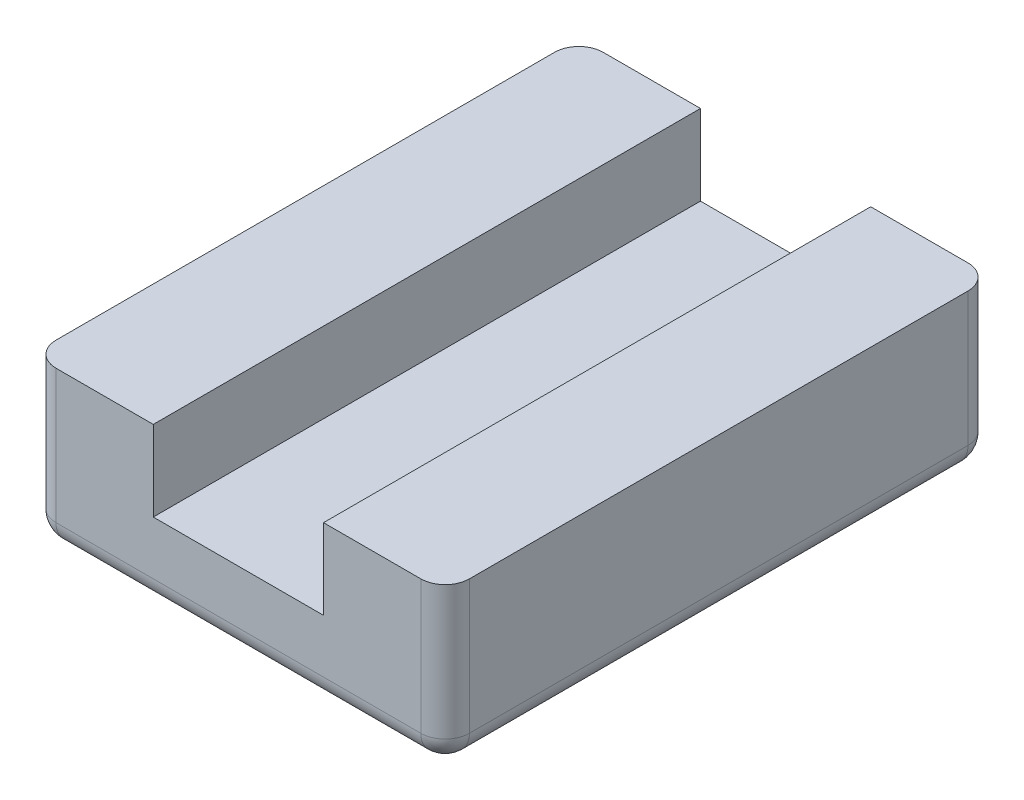
ISO-10303-21;
HEADER;
FILE_DESCRIPTION(('STEP AP214'),'2;1');
FILE_NAME('part.step','',(''),(''),'','','');
FILE_SCHEMA(('AUTOMOTIVE_DESIGN { 1 0 10303 214 1 1 1 1 }'));
ENDSEC;
DATA;
#1=APPLICATION_CONTEXT('core data for automotive mechanical design processes');
#2=APPLICATION_PROTOCOL_DEFINITION('international standard','automotive_design',2000,#1);
#3=PRODUCT_CONTEXT('',#1,'mechanical');
#4=PRODUCT('Part','Part','',(#3));
#5=PRODUCT_RELATED_PRODUCT_CATEGORY('part','',(#4));
#6=PRODUCT_DEFINITION_FORMATION('','',#4);
#7=PRODUCT_DEFINITION_CONTEXT('part definition',#1,'design');
#8=PRODUCT_DEFINITION('design','',#6,#7);
#9=PRODUCT_DEFINITION_SHAPE('','',#8);
#10=(LENGTH_UNIT() NAMED_UNIT(*) SI_UNIT(.MILLI.,.METRE.));
#11=(NAMED_UNIT(*) PLANE_ANGLE_UNIT() SI_UNIT($,.RADIAN.));
#12=(NAMED_UNIT(*) SI_UNIT($,.STERADIAN.) SOLID_ANGLE_UNIT());
#13=UNCERTAINTY_MEASURE_WITH_UNIT(LENGTH_MEASURE(1.E-05),#10,'distance_accuracy_value','');
#14=(GEOMETRIC_REPRESENTATION_CONTEXT(3) GLOBAL_UNCERTAINTY_ASSIGNED_CONTEXT((#13)) GLOBAL_UNIT_ASSIGNED_CONTEXT((#10,
#11,#12)) REPRESENTATION_CONTEXT('',''));
#15=CARTESIAN_POINT('',(0.,0.,0.));
#16=DIRECTION('',(0.,0.,1.));
#17=DIRECTION('',(1.,0.,0.));
#18=AXIS2_PLACEMENT_3D('',#15,#16,#17);
#19=CARTESIAN_POINT('',(0.,0.,22.5));
#20=DIRECTION('',(1.,0.,0.));
#21=DIRECTION('',(0.,1.,0.));
#22=AXIS2_PLACEMENT_3D('',#19,#20,#21);
#23=PLANE('',#22);
#24=DIRECTION('',(0.,0.,-1.));
#25=VECTOR('',#24,1.);
#26=CARTESIAN_POINT('',(0.,-5.5,22.5));
#27=LINE('',#26,#25);
#28=CARTESIAN_POINT('',(0.,-5.5,1.));
#29=VERTEX_POINT('',#28);
#30=CARTESIAN_POINT('',(0.,-5.5,21.5));
#31=VERTEX_POINT('',#30);
#32=EDGE_CURVE('E208',#29,#31,#27,.F.);
#33=ORIENTED_EDGE('',*,*,#32,.T.);
#34=DIRECTION('',(0.,-1.,0.));
#35=VECTOR('',#34,1.);
#36=CARTESIAN_POINT('',(0.,0.,21.5));
#37=LINE('',#36,#35);
#38=CARTESIAN_POINT('',(0.,0.,21.5));
#39=VERTEX_POINT('',#38);
#40=EDGE_CURVE('E243',#31,#39,#37,.F.);
#41=ORIENTED_EDGE('',*,*,#40,.T.);
#42=DIRECTION('',(0.,0.,-1.));
#43=VECTOR('',#42,1.);
#44=CARTESIAN_POINT('',(0.,0.,22.5));
#45=LINE('',#44,#43);
#46=CARTESIAN_POINT('',(0.,0.,1.00000000000001));
#47=VERTEX_POINT('',#46);
#48=EDGE_CURVE('E176',#39,#47,#45,.T.);
#49=ORIENTED_EDGE('',*,*,#48,.T.);
#50=DIRECTION('',(0.,-1.,0.));
#51=VECTOR('',#50,1.);
#52=CARTESIAN_POINT('',(0.,0.,1.));
#53=LINE('',#52,#51);
#54=EDGE_CURVE('E244',#47,#29,#53,.T.);
#55=ORIENTED_EDGE('',*,*,#54,.T.);
#56=EDGE_LOOP('',(#33,#41,#49,#55));
#57=FACE_BOUND('',#56,.T.);
#58=ADVANCED_FACE('F41',(#57),#23,.F.);
#59=CARTESIAN_POINT('',(0.,-6.5,22.5));
#60=DIRECTION('',(0.,1.,0.));
#61=DIRECTION('',(0.,0.,1.));
#62=AXIS2_PLACEMENT_3D('',#59,#60,#61);
#63=PLANE('',#62);
#64=CARTESIAN_POINT('',(2.5,-6.5,15.25));
#65=DIRECTION('',(0.,-1.,0.));
#66=DIRECTION('',(0.,0.,-1.));
#67=AXIS2_PLACEMENT_3D('',#64,#65,#66);
#68=CIRCLE('',#67,1.);
#69=CARTESIAN_POINT('',(2.5,-6.5,14.25));
#70=VERTEX_POINT('',#69);
#71=EDGE_CURVE('E276',#70,#70,#68,.T.);
#72=ORIENTED_EDGE('',*,*,#71,.F.);
#73=EDGE_LOOP('',(#72));
#74=FACE_BOUND('',#73,.T.);
#75=CARTESIAN_POINT('',(14.5,-6.5,7.25));
#76=DIRECTION('',(0.,-1.,0.));
#77=DIRECTION('',(0.,0.,-1.));
#78=AXIS2_PLACEMENT_3D('',#75,#76,#77);
#79=CIRCLE('',#78,1.);
#80=CARTESIAN_POINT('',(14.5,-6.5,6.25));
#81=VERTEX_POINT('',#80);
#82=EDGE_CURVE('E282',#81,#81,#79,.T.);
#83=ORIENTED_EDGE('',*,*,#82,.F.);
#84=EDGE_LOOP('',(#83));
#85=FACE_BOUND('',#84,.T.);
#86=CARTESIAN_POINT('',(14.5,-6.5,15.25));
#87=DIRECTION('',(0.,-1.,0.));
#88=DIRECTION('',(0.,0.,-1.));
#89=AXIS2_PLACEMENT_3D('',#86,#87,#88);
#90=CIRCLE('',#89,1.);
#91=CARTESIAN_POINT('',(14.5,-6.5,14.25));
#92=VERTEX_POINT('',#91);
#93=EDGE_CURVE('E285',#92,#92,#90,.T.);
#94=ORIENTED_EDGE('',*,*,#93,.F.);
#95=EDGE_LOOP('',(#94));
#96=FACE_BOUND('',#95,.T.);
#97=CARTESIAN_POINT('',(2.5,-6.5,7.25));
#98=DIRECTION('',(0.,-1.,0.));
#99=DIRECTION('',(0.,0.,-1.));
#100=AXIS2_PLACEMENT_3D('',#97,#98,#99);
#101=CIRCLE('',#100,1.);
#102=CARTESIAN_POINT('',(2.5,-6.5,6.25));
#103=VERTEX_POINT('',#102);
#104=EDGE_CURVE('E271',#103,#103,#101,.T.);
#105=ORIENTED_EDGE('',*,*,#104,.F.);
#106=EDGE_LOOP('',(#105));
#107=FACE_BOUND('',#106,.T.);
#108=DIRECTION('',(1.,0.,0.));
#109=VECTOR('',#108,1.);
#110=CARTESIAN_POINT('',(0.,-6.5,21.5));
#111=LINE('',#110,#109);
#112=CARTESIAN_POINT('',(16.,-6.5,21.5));
#113=VERTEX_POINT('',#112);
#114=CARTESIAN_POINT('',(1.,-6.5,21.5));
#115=VERTEX_POINT('',#114);
#116=EDGE_CURVE('E198',#113,#115,#111,.F.);
#117=ORIENTED_EDGE('',*,*,#116,.T.);
#118=DIRECTION('',(0.,0.,-1.));
#119=VECTOR('',#118,1.);
#120=CARTESIAN_POINT('',(1.,-6.5,22.5));
#121=LINE('',#120,#119);
#122=CARTESIAN_POINT('',(1.,-6.5,1.));
#123=VERTEX_POINT('',#122);
#124=EDGE_CURVE('E210',#115,#123,#121,.T.);
#125=ORIENTED_EDGE('',*,*,#124,.T.);
#126=DIRECTION('',(1.,0.,0.));
#127=VECTOR('',#126,1.);
#128=CARTESIAN_POINT('',(0.,-6.5,1.));
#129=LINE('',#128,#127);
#130=CARTESIAN_POINT('',(16.,-6.5,1.));
#131=VERTEX_POINT('',#130);
#132=EDGE_CURVE('E203',#123,#131,#129,.T.);
#133=ORIENTED_EDGE('',*,*,#132,.T.);
#134=DIRECTION('',(0.,0.,-1.));
#135=VECTOR('',#134,1.);
#136=CARTESIAN_POINT('',(16.,-6.5,22.5));
#137=LINE('',#136,#135);
#138=EDGE_CURVE('E201',#131,#113,#137,.F.);
#139=ORIENTED_EDGE('',*,*,#138,.T.);
#140=EDGE_LOOP('',(#117,#125,#133,#139));
#141=FACE_BOUND('',#140,.T.);
#142=ADVANCED_FACE('F300',(#74,#85,#96,#107,#141),#63,.F.);
#143=CARTESIAN_POINT('',(17.,0.,22.5));
#144=DIRECTION('',(-1.,0.,0.));
#145=DIRECTION('',(0.,0.,1.));
#146=AXIS2_PLACEMENT_3D('',#143,#144,#145);
#147=PLANE('',#146);
#148=DIRECTION('',(0.,0.,-1.));
#149=VECTOR('',#148,1.);
#150=CARTESIAN_POINT('',(17.,0.,22.5));
#151=LINE('',#150,#149);
#152=CARTESIAN_POINT('',(17.,0.,21.5));
#153=VERTEX_POINT('',#152);
#154=CARTESIAN_POINT('',(17.,0.,1.00000000000001));
#155=VERTEX_POINT('',#154);
#156=EDGE_CURVE('E161',#153,#155,#151,.T.);
#157=ORIENTED_EDGE('',*,*,#156,.F.);
#158=DIRECTION('',(0.,1.,0.));
#159=VECTOR('',#158,1.);
#160=CARTESIAN_POINT('',(17.,-5.5,21.5));
#161=LINE('',#160,#159);
#162=CARTESIAN_POINT('',(17.,-5.5,21.5));
#163=VERTEX_POINT('',#162);
#164=EDGE_CURVE('E252',#153,#163,#161,.F.);
#165=ORIENTED_EDGE('',*,*,#164,.T.);
#166=DIRECTION('',(0.,0.,-1.));
#167=VECTOR('',#166,1.);
#168=CARTESIAN_POINT('',(17.,-5.5,22.5));
#169=LINE('',#168,#167);
#170=CARTESIAN_POINT('',(17.,-5.5,1.));
#171=VERTEX_POINT('',#170);
#172=EDGE_CURVE('E217',#163,#171,#169,.T.);
#173=ORIENTED_EDGE('',*,*,#172,.T.);
#174=DIRECTION('',(0.,1.,0.));
#175=VECTOR('',#174,1.);
#176=CARTESIAN_POINT('',(17.,0.,1.));
#177=LINE('',#176,#175);
#178=EDGE_CURVE('E59',#171,#155,#177,.T.);
#179=ORIENTED_EDGE('',*,*,#178,.T.);
#180=EDGE_LOOP('',(#157,#165,#173,#179));
#181=FACE_BOUND('',#180,.T.);
#182=ADVANCED_FACE('F304',(#181),#147,.F.);
#183=CARTESIAN_POINT('',(12.,0.,22.5));
#184=DIRECTION('',(0.,-1.,0.));
#185=DIRECTION('',(0.,0.,-1.));
#186=AXIS2_PLACEMENT_3D('',#183,#184,#185);
#187=PLANE('',#186);
#188=DIRECTION('',(-1.,0.,0.));
#189=VECTOR('',#188,1.);
#190=CARTESIAN_POINT('',(12.,0.,22.5));
#191=LINE('',#190,#189);
#192=CARTESIAN_POINT('',(16.,0.,22.5));
#193=VERTEX_POINT('',#192);
#194=CARTESIAN_POINT('',(12.,0.,22.5));
#195=VERTEX_POINT('',#194);
#196=EDGE_CURVE('E144',#193,#195,#191,.T.);
#197=ORIENTED_EDGE('',*,*,#196,.F.);
#198=CARTESIAN_POINT('',(16.,0.,21.5));
#199=DIRECTION('',(0.,-1.,0.));
#200=DIRECTION('',(0.,0.,-1.));
#201=AXIS2_PLACEMENT_3D('',#198,#199,#200);
#202=CIRCLE('',#201,1.);
#203=EDGE_CURVE('E62',#193,#153,#202,.F.);
#204=ORIENTED_EDGE('',*,*,#203,.T.);
#205=ORIENTED_EDGE('',*,*,#156,.T.);
#206=CARTESIAN_POINT('',(16.,0.,1.));
#207=DIRECTION('',(0.,-1.,0.));
#208=DIRECTION('',(0.,0.,-1.));
#209=AXIS2_PLACEMENT_3D('',#206,#207,#208);
#210=CIRCLE('',#209,1.);
#211=CARTESIAN_POINT('',(16.,0.,0.));
#212=VERTEX_POINT('',#211);
#213=EDGE_CURVE('E254',#155,#212,#210,.F.);
#214=ORIENTED_EDGE('',*,*,#213,.T.);
#215=DIRECTION('',(-1.,0.,0.));
#216=VECTOR('',#215,1.);
#217=CARTESIAN_POINT('',(12.,0.,0.));
#218=LINE('',#217,#216);
#219=CARTESIAN_POINT('',(12.,0.,0.));
#220=VERTEX_POINT('',#219);
#221=EDGE_CURVE('E159',#212,#220,#218,.T.);
#222=ORIENTED_EDGE('',*,*,#221,.T.);
#223=DIRECTION('',(0.,0.,-1.));
#224=VECTOR('',#223,1.);
#225=CARTESIAN_POINT('',(12.,0.,22.5));
#226=LINE('',#225,#224);
#227=EDGE_CURVE('E157',#195,#220,#226,.T.);
#228=ORIENTED_EDGE('',*,*,#227,.F.);
#229=EDGE_LOOP('',(#197,#204,#205,#214,#222,#228));
#230=FACE_BOUND('',#229,.T.);
#231=ADVANCED_FACE('F160',(#230),#187,.F.);
#232=CARTESIAN_POINT('',(12.,0.,22.5));
#233=DIRECTION('',(1.,0.,0.));
#234=DIRECTION('',(0.,0.,-1.));
#235=AXIS2_PLACEMENT_3D('',#232,#233,#234);
#236=PLANE('',#235);
#237=DIRECTION('',(0.,-1.,0.));
#238=VECTOR('',#237,1.);
#239=CARTESIAN_POINT('',(12.,0.,0.));
#240=LINE('',#239,#238);
#241=CARTESIAN_POINT('',(12.,-3.3,0.));
#242=VERTEX_POINT('',#241);
#243=EDGE_CURVE('E178',#220,#242,#240,.T.);
#244=ORIENTED_EDGE('',*,*,#243,.T.);
#245=DIRECTION('',(0.,0.,-1.));
#246=VECTOR('',#245,1.);
#247=CARTESIAN_POINT('',(12.,-3.3,22.5));
#248=LINE('',#247,#246);
#249=CARTESIAN_POINT('',(12.,-3.3,22.5));
#250=VERTEX_POINT('',#249);
#251=EDGE_CURVE('E165',#250,#242,#248,.T.);
#252=ORIENTED_EDGE('',*,*,#251,.F.);
#253=DIRECTION('',(0.,-1.,0.));
#254=VECTOR('',#253,1.);
#255=CARTESIAN_POINT('',(12.,0.,22.5));
#256=LINE('',#255,#254);
#257=EDGE_CURVE('E150',#195,#250,#256,.T.);
#258=ORIENTED_EDGE('',*,*,#257,.F.);
#259=ORIENTED_EDGE('',*,*,#227,.T.);
#260=EDGE_LOOP('',(#244,#252,#258,#259));
#261=FACE_BOUND('',#260,.T.);
#262=ADVANCED_FACE('F162',(#261),#236,.F.);
#263=CARTESIAN_POINT('',(5.,-3.3,22.5));
#264=DIRECTION('',(0.,-1.,0.));
#265=DIRECTION('',(0.,0.,-1.));
#266=AXIS2_PLACEMENT_3D('',#263,#264,#265);
#267=PLANE('',#266);
#268=DIRECTION('',(-1.,0.,0.));
#269=VECTOR('',#268,1.);
#270=CARTESIAN_POINT('',(5.,-3.3,0.));
#271=LINE('',#270,#269);
#272=CARTESIAN_POINT('',(5.,-3.3,0.));
#273=VERTEX_POINT('',#272);
#274=EDGE_CURVE('E182',#242,#273,#271,.T.);
#275=ORIENTED_EDGE('',*,*,#274,.T.);
#276=DIRECTION('',(0.,0.,-1.));
#277=VECTOR('',#276,1.);
#278=CARTESIAN_POINT('',(5.,-3.3,22.5));
#279=LINE('',#278,#277);
#280=CARTESIAN_POINT('',(5.,-3.3,22.5));
#281=VERTEX_POINT('',#280);
#282=EDGE_CURVE('E193',#281,#273,#279,.T.);
#283=ORIENTED_EDGE('',*,*,#282,.F.);
#284=DIRECTION('',(-1.,0.,0.));
#285=VECTOR('',#284,1.);
#286=CARTESIAN_POINT('',(5.,-3.3,22.5));
#287=LINE('',#286,#285);
#288=EDGE_CURVE('E169',#250,#281,#287,.T.);
#289=ORIENTED_EDGE('',*,*,#288,.F.);
#290=ORIENTED_EDGE('',*,*,#251,.T.);
#291=EDGE_LOOP('',(#275,#283,#289,#290));
#292=FACE_BOUND('',#291,.T.);
#293=ADVANCED_FACE('F367',(#292),#267,.F.);
#294=CARTESIAN_POINT('',(5.,0.,22.5));
#295=DIRECTION('',(-1.,0.,0.));
#296=DIRECTION('',(0.,-1.,0.));
#297=AXIS2_PLACEMENT_3D('',#294,#295,#296);
#298=PLANE('',#297);
#299=DIRECTION('',(0.,1.,0.));
#300=VECTOR('',#299,1.);
#301=CARTESIAN_POINT('',(5.,0.,0.));
#302=LINE('',#301,#300);
#303=CARTESIAN_POINT('',(5.,0.,0.));
#304=VERTEX_POINT('',#303);
#305=EDGE_CURVE('E185',#273,#304,#302,.T.);
#306=ORIENTED_EDGE('',*,*,#305,.T.);
#307=DIRECTION('',(0.,0.,-1.));
#308=VECTOR('',#307,1.);
#309=CARTESIAN_POINT('',(5.,0.,22.5));
#310=LINE('',#309,#308);
#311=CARTESIAN_POINT('',(5.,0.,22.5));
#312=VERTEX_POINT('',#311);
#313=EDGE_CURVE('E187',#312,#304,#310,.T.);
#314=ORIENTED_EDGE('',*,*,#313,.F.);
#315=DIRECTION('',(0.,1.,0.));
#316=VECTOR('',#315,1.);
#317=CARTESIAN_POINT('',(5.,0.,22.5));
#318=LINE('',#317,#316);
#319=EDGE_CURVE('E168',#281,#312,#318,.T.);
#320=ORIENTED_EDGE('',*,*,#319,.F.);
#321=ORIENTED_EDGE('',*,*,#282,.T.);
#322=EDGE_LOOP('',(#306,#314,#320,#321));
#323=FACE_BOUND('',#322,.T.);
#324=ADVANCED_FACE('F365',(#323),#298,.F.);
#325=CARTESIAN_POINT('',(0.,0.,22.5));
#326=DIRECTION('',(0.,-1.,0.));
#327=DIRECTION('',(0.,0.,-1.));
#328=AXIS2_PLACEMENT_3D('',#325,#326,#327);
#329=PLANE('',#328);
#330=ORIENTED_EDGE('',*,*,#48,.F.);
#331=CARTESIAN_POINT('',(1.,0.,21.5));
#332=DIRECTION('',(0.,-1.,0.));
#333=DIRECTION('',(0.,0.,-1.));
#334=AXIS2_PLACEMENT_3D('',#331,#332,#333);
#335=CIRCLE('',#334,1.);
#336=CARTESIAN_POINT('',(1.,0.,22.5));
#337=VERTEX_POINT('',#336);
#338=EDGE_CURVE('E246',#39,#337,#335,.F.);
#339=ORIENTED_EDGE('',*,*,#338,.T.);
#340=DIRECTION('',(-1.,0.,0.));
#341=VECTOR('',#340,1.);
#342=CARTESIAN_POINT('',(0.,0.,22.5));
#343=LINE('',#342,#341);
#344=EDGE_CURVE('E173',#312,#337,#343,.T.);
#345=ORIENTED_EDGE('',*,*,#344,.F.);
#346=ORIENTED_EDGE('',*,*,#313,.T.);
#347=DIRECTION('',(-1.,0.,0.));
#348=VECTOR('',#347,1.);
#349=CARTESIAN_POINT('',(0.,0.,0.));
#350=LINE('',#349,#348);
#351=CARTESIAN_POINT('',(1.,0.,0.));
#352=VERTEX_POINT('',#351);
#353=EDGE_CURVE('E155',#304,#352,#350,.T.);
#354=ORIENTED_EDGE('',*,*,#353,.T.);
#355=CARTESIAN_POINT('',(1.,0.,1.));
#356=DIRECTION('',(0.,-1.,0.));
#357=DIRECTION('',(0.,0.,-1.));
#358=AXIS2_PLACEMENT_3D('',#355,#356,#357);
#359=CIRCLE('',#358,1.);
#360=EDGE_CURVE('E249',#352,#47,#359,.F.);
#361=ORIENTED_EDGE('',*,*,#360,.T.);
#362=EDGE_LOOP('',(#330,#339,#345,#346,#354,#361));
#363=FACE_BOUND('',#362,.T.);
#364=ADVANCED_FACE('F328',(#363),#329,.F.);
#365=CARTESIAN_POINT('',(0.,0.,22.5));
#366=DIRECTION('',(0.,0.,1.));
#367=DIRECTION('',(1.,0.,0.));
#368=AXIS2_PLACEMENT_3D('',#365,#366,#367);
#369=PLANE('',#368);
#370=ORIENTED_EDGE('',*,*,#344,.T.);
#371=DIRECTION('',(0.,-1.,0.));
#372=VECTOR('',#371,1.);
#373=CARTESIAN_POINT('',(1.,-5.5,22.5));
#374=LINE('',#373,#372);
#375=CARTESIAN_POINT('',(1.,-5.5,22.5));
#376=VERTEX_POINT('',#375);
#377=EDGE_CURVE('E242',#337,#376,#374,.T.);
#378=ORIENTED_EDGE('',*,*,#377,.T.);
#379=DIRECTION('',(1.,0.,0.));
#380=VECTOR('',#379,1.);
#381=CARTESIAN_POINT('',(17.,-5.5,22.5));
#382=LINE('',#381,#380);
#383=CARTESIAN_POINT('',(16.,-5.5,22.5));
#384=VERTEX_POINT('',#383);
#385=EDGE_CURVE('E219',#376,#384,#382,.T.);
#386=ORIENTED_EDGE('',*,*,#385,.T.);
#387=DIRECTION('',(0.,1.,0.));
#388=VECTOR('',#387,1.);
#389=CARTESIAN_POINT('',(16.,0.,22.5));
#390=LINE('',#389,#388);
#391=EDGE_CURVE('E151',#384,#193,#390,.T.);
#392=ORIENTED_EDGE('',*,*,#391,.T.);
#393=ORIENTED_EDGE('',*,*,#196,.T.);
#394=ORIENTED_EDGE('',*,*,#257,.T.);
#395=ORIENTED_EDGE('',*,*,#288,.T.);
#396=ORIENTED_EDGE('',*,*,#319,.T.);
#397=EDGE_LOOP('',(#370,#378,#386,#392,#393,#394,#395,#396));
#398=FACE_BOUND('',#397,.T.);
#399=ADVANCED_FACE('F147',(#398),#369,.T.);
#400=CARTESIAN_POINT('',(0.,0.,0.));
#401=DIRECTION('',(0.,0.,1.));
#402=DIRECTION('',(1.,0.,0.));
#403=AXIS2_PLACEMENT_3D('',#400,#401,#402);
#404=PLANE('',#403);
#405=ORIENTED_EDGE('',*,*,#221,.F.);
#406=DIRECTION('',(0.,1.,0.));
#407=VECTOR('',#406,1.);
#408=CARTESIAN_POINT('',(16.,0.,0.));
#409=LINE('',#408,#407);
#410=CARTESIAN_POINT('',(16.,-5.5,0.));
#411=VERTEX_POINT('',#410);
#412=EDGE_CURVE('E11',#212,#411,#409,.F.);
#413=ORIENTED_EDGE('',*,*,#412,.T.);
#414=DIRECTION('',(1.,0.,0.));
#415=VECTOR('',#414,1.);
#416=CARTESIAN_POINT('',(0.,-5.5,0.));
#417=LINE('',#416,#415);
#418=CARTESIAN_POINT('',(1.,-5.5,0.));
#419=VERTEX_POINT('',#418);
#420=EDGE_CURVE('E215',#411,#419,#417,.F.);
#421=ORIENTED_EDGE('',*,*,#420,.T.);
#422=DIRECTION('',(0.,-1.,0.));
#423=VECTOR('',#422,1.);
#424=CARTESIAN_POINT('',(1.,0.,0.));
#425=LINE('',#424,#423);
#426=EDGE_CURVE('E49',#419,#352,#425,.F.);
#427=ORIENTED_EDGE('',*,*,#426,.T.);
#428=ORIENTED_EDGE('',*,*,#353,.F.);
#429=ORIENTED_EDGE('',*,*,#305,.F.);
#430=ORIENTED_EDGE('',*,*,#274,.F.);
#431=ORIENTED_EDGE('',*,*,#243,.F.);
#432=EDGE_LOOP('',(#405,#413,#421,#427,#428,#429,#430,#431));
#433=FACE_BOUND('',#432,.T.);
#434=ADVANCED_FACE('F337',(#433),#404,.F.);
#435=CARTESIAN_POINT('',(16.,-5.5,22.5));
#436=DIRECTION('',(0.,0.,-1.));
#437=DIRECTION('',(-1.,0.,0.));
#438=AXIS2_PLACEMENT_3D('',#435,#436,#437);
#439=CYLINDRICAL_SURFACE('',#438,1.);
#440=ORIENTED_EDGE('',*,*,#172,.F.);
#441=CARTESIAN_POINT('',(16.,-5.5,21.5));
#442=DIRECTION('',(0.,0.,-1.));
#443=DIRECTION('',(-1.,0.,0.));
#444=AXIS2_PLACEMENT_3D('',#441,#442,#443);
#445=CIRCLE('',#444,1.);
#446=EDGE_CURVE('E231',#163,#113,#445,.T.);
#447=ORIENTED_EDGE('',*,*,#446,.T.);
#448=ORIENTED_EDGE('',*,*,#138,.F.);
#449=CARTESIAN_POINT('',(16.,-5.5,1.));
#450=DIRECTION('',(0.,0.,-1.));
#451=DIRECTION('',(-1.,0.,0.));
#452=AXIS2_PLACEMENT_3D('',#449,#450,#451);
#453=CIRCLE('',#452,1.);
#454=EDGE_CURVE('E232',#131,#171,#453,.F.);
#455=ORIENTED_EDGE('',*,*,#454,.T.);
#456=EDGE_LOOP('',(#440,#447,#448,#455));
#457=FACE_BOUND('',#456,.T.);
#458=ADVANCED_FACE('F348',(#457),#439,.T.);
#459=CARTESIAN_POINT('',(0.,-5.5,21.5));
#460=DIRECTION('',(-1.,0.,0.));
#461=DIRECTION('',(0.,0.,1.));
#462=AXIS2_PLACEMENT_3D('',#459,#460,#461);
#463=CYLINDRICAL_SURFACE('',#462,1.);
#464=ORIENTED_EDGE('',*,*,#385,.F.);
#465=CARTESIAN_POINT('',(1.,-5.5,21.5));
#466=DIRECTION('',(-1.,0.,0.));
#467=DIRECTION('',(0.,0.,1.));
#468=AXIS2_PLACEMENT_3D('',#465,#466,#467);
#469=CIRCLE('',#468,1.);
#470=EDGE_CURVE('E228',#376,#115,#469,.F.);
#471=ORIENTED_EDGE('',*,*,#470,.T.);
#472=ORIENTED_EDGE('',*,*,#116,.F.);
#473=CARTESIAN_POINT('',(16.,-5.5,21.5));
#474=DIRECTION('',(-1.,0.,0.));
#475=DIRECTION('',(0.,0.,1.));
#476=AXIS2_PLACEMENT_3D('',#473,#474,#475);
#477=CIRCLE('',#476,1.);
#478=EDGE_CURVE('E229',#113,#384,#477,.T.);
#479=ORIENTED_EDGE('',*,*,#478,.T.);
#480=EDGE_LOOP('',(#464,#471,#472,#479));
#481=FACE_BOUND('',#480,.T.);
#482=ADVANCED_FACE('F360',(#481),#463,.T.);
#483=CARTESIAN_POINT('',(0.,-5.5,1.));
#484=DIRECTION('',(1.,0.,0.));
#485=DIRECTION('',(0.,0.,-1.));
#486=AXIS2_PLACEMENT_3D('',#483,#484,#485);
#487=CYLINDRICAL_SURFACE('',#486,1.);
#488=ORIENTED_EDGE('',*,*,#420,.F.);
#489=CARTESIAN_POINT('',(16.,-5.5,1.));
#490=DIRECTION('',(1.,0.,0.));
#491=DIRECTION('',(0.,0.,-1.));
#492=AXIS2_PLACEMENT_3D('',#489,#490,#491);
#493=CIRCLE('',#492,1.);
#494=EDGE_CURVE('E236',#411,#131,#493,.F.);
#495=ORIENTED_EDGE('',*,*,#494,.T.);
#496=ORIENTED_EDGE('',*,*,#132,.F.);
#497=CARTESIAN_POINT('',(1.,-5.5,1.));
#498=DIRECTION('',(1.,0.,0.));
#499=DIRECTION('',(0.,0.,-1.));
#500=AXIS2_PLACEMENT_3D('',#497,#498,#499);
#501=CIRCLE('',#500,1.);
#502=EDGE_CURVE('E233',#123,#419,#501,.T.);
#503=ORIENTED_EDGE('',*,*,#502,.T.);
#504=EDGE_LOOP('',(#488,#495,#496,#503));
#505=FACE_BOUND('',#504,.T.);
#506=ADVANCED_FACE('F336',(#505),#487,.T.);
#507=CARTESIAN_POINT('',(1.,-5.5,22.5));
#508=DIRECTION('',(0.,0.,-1.));
#509=DIRECTION('',(-1.,0.,0.));
#510=AXIS2_PLACEMENT_3D('',#507,#508,#509);
#511=CYLINDRICAL_SURFACE('',#510,1.);
#512=ORIENTED_EDGE('',*,*,#124,.F.);
#513=CARTESIAN_POINT('',(1.,-5.5,21.5));
#514=DIRECTION('',(0.,0.,-1.));
#515=DIRECTION('',(-1.,0.,0.));
#516=AXIS2_PLACEMENT_3D('',#513,#514,#515);
#517=CIRCLE('',#516,1.);
#518=EDGE_CURVE('E225',#115,#31,#517,.T.);
#519=ORIENTED_EDGE('',*,*,#518,.T.);
#520=ORIENTED_EDGE('',*,*,#32,.F.);
#521=CARTESIAN_POINT('',(1.,-5.5,1.));
#522=DIRECTION('',(0.,0.,-1.));
#523=DIRECTION('',(-1.,0.,0.));
#524=AXIS2_PLACEMENT_3D('',#521,#522,#523);
#525=CIRCLE('',#524,1.);
#526=EDGE_CURVE('E218',#29,#123,#525,.F.);
#527=ORIENTED_EDGE('',*,*,#526,.T.);
#528=EDGE_LOOP('',(#512,#519,#520,#527));
#529=FACE_BOUND('',#528,.T.);
#530=ADVANCED_FACE('F315',(#529),#511,.T.);
#531=CARTESIAN_POINT('',(1.,0.,21.5));
#532=DIRECTION('',(0.,1.,0.));
#533=DIRECTION('',(-1.,0.,0.));
#534=AXIS2_PLACEMENT_3D('',#531,#532,#533);
#535=CYLINDRICAL_SURFACE('',#534,1.);
#536=ORIENTED_EDGE('',*,*,#338,.F.);
#537=ORIENTED_EDGE('',*,*,#40,.F.);
#538=CARTESIAN_POINT('',(1.,-5.5,21.5));
#539=DIRECTION('',(0.,-1.,0.));
#540=DIRECTION('',(0.,0.,-1.));
#541=AXIS2_PLACEMENT_3D('',#538,#539,#540);
#542=CIRCLE('',#541,1.);
#543=EDGE_CURVE('E177',#376,#31,#542,.T.);
#544=ORIENTED_EDGE('',*,*,#543,.F.);
#545=ORIENTED_EDGE('',*,*,#377,.F.);
#546=EDGE_LOOP('',(#536,#537,#544,#545));
#547=FACE_BOUND('',#546,.T.);
#548=ADVANCED_FACE('F321',(#547),#535,.T.);
#549=CARTESIAN_POINT('',(1.,-5.5,21.5));
#550=DIRECTION('',(0.,0.,1.));
#551=DIRECTION('',(1.,0.,0.));
#552=AXIS2_PLACEMENT_3D('',#549,#550,#551);
#553=SPHERICAL_SURFACE('',#552,1.);
#554=ORIENTED_EDGE('',*,*,#518,.F.);
#555=ORIENTED_EDGE('',*,*,#470,.F.);
#556=ORIENTED_EDGE('',*,*,#543,.T.);
#557=EDGE_LOOP('',(#554,#555,#556));
#558=FACE_BOUND('',#557,.T.);
#559=ADVANCED_FACE('F319',(#558),#553,.T.);
#560=CARTESIAN_POINT('',(16.,0.,21.5));
#561=DIRECTION('',(0.,-1.,0.));
#562=DIRECTION('',(0.,0.,-1.));
#563=AXIS2_PLACEMENT_3D('',#560,#561,#562);
#564=CYLINDRICAL_SURFACE('',#563,1.);
#565=ORIENTED_EDGE('',*,*,#203,.F.);
#566=ORIENTED_EDGE('',*,*,#391,.F.);
#567=CARTESIAN_POINT('',(16.,-5.5,21.5));
#568=DIRECTION('',(0.,-1.,0.));
#569=DIRECTION('',(0.,0.,-1.));
#570=AXIS2_PLACEMENT_3D('',#567,#568,#569);
#571=CIRCLE('',#570,1.);
#572=EDGE_CURVE('E260',#163,#384,#571,.T.);
#573=ORIENTED_EDGE('',*,*,#572,.F.);
#574=ORIENTED_EDGE('',*,*,#164,.F.);
#575=EDGE_LOOP('',(#565,#566,#573,#574));
#576=FACE_BOUND('',#575,.T.);
#577=ADVANCED_FACE('F354',(#576),#564,.T.);
#578=CARTESIAN_POINT('',(16.,-5.5,21.5));
#579=DIRECTION('',(0.,0.,1.));
#580=DIRECTION('',(1.,0.,0.));
#581=AXIS2_PLACEMENT_3D('',#578,#579,#580);
#582=SPHERICAL_SURFACE('',#581,1.);
#583=ORIENTED_EDGE('',*,*,#478,.F.);
#584=ORIENTED_EDGE('',*,*,#446,.F.);
#585=ORIENTED_EDGE('',*,*,#572,.T.);
#586=EDGE_LOOP('',(#583,#584,#585));
#587=FACE_BOUND('',#586,.T.);
#588=ADVANCED_FACE('F355',(#587),#582,.T.);
#589=CARTESIAN_POINT('',(16.,0.,1.));
#590=DIRECTION('',(0.,1.,0.));
#591=DIRECTION('',(0.,0.,1.));
#592=AXIS2_PLACEMENT_3D('',#589,#590,#591);
#593=CYLINDRICAL_SURFACE('',#592,1.);
#594=ORIENTED_EDGE('',*,*,#213,.F.);
#595=ORIENTED_EDGE('',*,*,#178,.F.);
#596=CARTESIAN_POINT('',(16.,-5.5,1.));
#597=DIRECTION('',(0.,-1.,0.));
#598=DIRECTION('',(1.,0.,0.));
#599=AXIS2_PLACEMENT_3D('',#596,#597,#598);
#600=CIRCLE('',#599,1.);
#601=EDGE_CURVE('E259',#411,#171,#600,.T.);
#602=ORIENTED_EDGE('',*,*,#601,.F.);
#603=ORIENTED_EDGE('',*,*,#412,.F.);
#604=EDGE_LOOP('',(#594,#595,#602,#603));
#605=FACE_BOUND('',#604,.T.);
#606=ADVANCED_FACE('F342',(#605),#593,.T.);
#607=CARTESIAN_POINT('',(16.,-5.5,1.));
#608=DIRECTION('',(0.,0.,1.));
#609=DIRECTION('',(1.,0.,0.));
#610=AXIS2_PLACEMENT_3D('',#607,#608,#609);
#611=SPHERICAL_SURFACE('',#610,1.);
#612=ORIENTED_EDGE('',*,*,#601,.T.);
#613=ORIENTED_EDGE('',*,*,#454,.F.);
#614=ORIENTED_EDGE('',*,*,#494,.F.);
#615=EDGE_LOOP('',(#612,#613,#614));
#616=FACE_BOUND('',#615,.T.);
#617=ADVANCED_FACE('F344',(#616),#611,.T.);
#618=CARTESIAN_POINT('',(1.,0.,1.));
#619=DIRECTION('',(0.,-1.,0.));
#620=DIRECTION('',(1.,0.,0.));
#621=AXIS2_PLACEMENT_3D('',#618,#619,#620);
#622=CYLINDRICAL_SURFACE('',#621,1.);
#623=ORIENTED_EDGE('',*,*,#360,.F.);
#624=ORIENTED_EDGE('',*,*,#426,.F.);
#625=CARTESIAN_POINT('',(1.,-5.5,1.));
#626=DIRECTION('',(0.,-1.,0.));
#627=DIRECTION('',(0.,0.,-1.));
#628=AXIS2_PLACEMENT_3D('',#625,#626,#627);
#629=CIRCLE('',#628,1.);
#630=EDGE_CURVE('E44',#29,#419,#629,.T.);
#631=ORIENTED_EDGE('',*,*,#630,.F.);
#632=ORIENTED_EDGE('',*,*,#54,.F.);
#633=EDGE_LOOP('',(#623,#624,#631,#632));
#634=FACE_BOUND('',#633,.T.);
#635=ADVANCED_FACE('F43',(#634),#622,.T.);
#636=CARTESIAN_POINT('',(1.,-5.5,1.));
#637=DIRECTION('',(0.,0.,1.));
#638=DIRECTION('',(1.,0.,0.));
#639=AXIS2_PLACEMENT_3D('',#636,#637,#638);
#640=SPHERICAL_SURFACE('',#639,1.);
#641=ORIENTED_EDGE('',*,*,#630,.T.);
#642=ORIENTED_EDGE('',*,*,#502,.F.);
#643=ORIENTED_EDGE('',*,*,#526,.F.);
#644=EDGE_LOOP('',(#641,#642,#643));
#645=FACE_BOUND('',#644,.T.);
#646=ADVANCED_FACE('F334',(#645),#640,.T.);
#647=CARTESIAN_POINT('',(2.5,-4.,7.25));
#648=DIRECTION('',(0.,-1.,0.));
#649=DIRECTION('',(0.,0.,-1.));
#650=AXIS2_PLACEMENT_3D('',#647,#648,#649);
#651=CYLINDRICAL_SURFACE('',#650,1.);
#652=CARTESIAN_POINT('',(2.5,-4.,7.25));
#653=DIRECTION('',(0.,-1.,0.));
#654=DIRECTION('',(0.,0.,-1.));
#655=AXIS2_PLACEMENT_3D('',#652,#653,#654);
#656=CIRCLE('',#655,1.);
#657=CARTESIAN_POINT('',(2.5,-4.,6.25));
#658=VERTEX_POINT('',#657);
#659=EDGE_CURVE('E266',#658,#658,#656,.T.);
#660=ORIENTED_EDGE('',*,*,#659,.F.);
#661=EDGE_LOOP('',(#660));
#662=FACE_BOUND('',#661,.T.);
#663=ORIENTED_EDGE('',*,*,#104,.T.);
#664=EDGE_LOOP('',(#663));
#665=FACE_BOUND('',#664,.T.);
#666=ADVANCED_FACE('F401',(#662,#665),#651,.F.);
#667=CARTESIAN_POINT('',(2.5,-4.,7.25));
#668=DIRECTION('',(0.,-1.,0.));
#669=DIRECTION('',(0.,0.,-1.));
#670=AXIS2_PLACEMENT_3D('',#667,#668,#669);
#671=PLANE('',#670);
#672=ORIENTED_EDGE('',*,*,#659,.T.);
#673=EDGE_LOOP('',(#672));
#674=FACE_BOUND('',#673,.T.);
#675=ADVANCED_FACE('F407',(#674),#671,.T.);
#676=CARTESIAN_POINT('',(14.5,-4.,15.25));
#677=DIRECTION('',(0.,-1.,0.));
#678=DIRECTION('',(0.,0.,-1.));
#679=AXIS2_PLACEMENT_3D('',#676,#677,#678);
#680=CYLINDRICAL_SURFACE('',#679,1.);
#681=CARTESIAN_POINT('',(14.5,-4.,15.25));
#682=DIRECTION('',(0.,-1.,0.));
#683=DIRECTION('',(0.,0.,-1.));
#684=AXIS2_PLACEMENT_3D('',#681,#682,#683);
#685=CIRCLE('',#684,1.);
#686=CARTESIAN_POINT('',(14.5,-4.,14.25));
#687=VERTEX_POINT('',#686);
#688=EDGE_CURVE('E287',#687,#687,#685,.T.);
#689=ORIENTED_EDGE('',*,*,#688,.F.);
#690=EDGE_LOOP('',(#689));
#691=FACE_BOUND('',#690,.T.);
#692=ORIENTED_EDGE('',*,*,#93,.T.);
#693=EDGE_LOOP('',(#692));
#694=FACE_BOUND('',#693,.T.);
#695=ADVANCED_FACE('F297',(#691,#694),#680,.F.);
#696=CARTESIAN_POINT('',(14.5,-4.,15.25));
#697=DIRECTION('',(0.,-1.,0.));
#698=DIRECTION('',(0.,0.,-1.));
#699=AXIS2_PLACEMENT_3D('',#696,#697,#698);
#700=PLANE('',#699);
#701=ORIENTED_EDGE('',*,*,#688,.T.);
#702=EDGE_LOOP('',(#701));
#703=FACE_BOUND('',#702,.T.);
#704=ADVANCED_FACE('F526',(#703),#700,.T.);
#705=CARTESIAN_POINT('',(14.5,-4.,7.25));
#706=DIRECTION('',(0.,-1.,0.));
#707=DIRECTION('',(0.,0.,-1.));
#708=AXIS2_PLACEMENT_3D('',#705,#706,#707);
#709=CYLINDRICAL_SURFACE('',#708,1.);
#710=CARTESIAN_POINT('',(14.5,-4.,7.25));
#711=DIRECTION('',(0.,-1.,0.));
#712=DIRECTION('',(0.,0.,-1.));
#713=AXIS2_PLACEMENT_3D('',#710,#711,#712);
#714=CIRCLE('',#713,1.);
#715=CARTESIAN_POINT('',(14.5,-4.,6.25));
#716=VERTEX_POINT('',#715);
#717=EDGE_CURVE('E277',#716,#716,#714,.T.);
#718=ORIENTED_EDGE('',*,*,#717,.F.);
#719=EDGE_LOOP('',(#718));
#720=FACE_BOUND('',#719,.T.);
#721=ORIENTED_EDGE('',*,*,#82,.T.);
#722=EDGE_LOOP('',(#721));
#723=FACE_BOUND('',#722,.T.);
#724=ADVANCED_FACE('F539',(#720,#723),#709,.F.);
#725=CARTESIAN_POINT('',(14.5,-4.,7.25));
#726=DIRECTION('',(0.,-1.,0.));
#727=DIRECTION('',(0.,0.,-1.));
#728=AXIS2_PLACEMENT_3D('',#725,#726,#727);
#729=PLANE('',#728);
#730=ORIENTED_EDGE('',*,*,#717,.T.);
#731=EDGE_LOOP('',(#730));
#732=FACE_BOUND('',#731,.T.);
#733=ADVANCED_FACE('F543',(#732),#729,.T.);
#734=CARTESIAN_POINT('',(2.5,-4.,15.25));
#735=DIRECTION('',(0.,-1.,0.));
#736=DIRECTION('',(0.,0.,-1.));
#737=AXIS2_PLACEMENT_3D('',#734,#735,#736);
#738=CYLINDRICAL_SURFACE('',#737,1.);
#739=CARTESIAN_POINT('',(2.5,-4.,15.25));
#740=DIRECTION('',(0.,-1.,0.));
#741=DIRECTION('',(0.,0.,-1.));
#742=AXIS2_PLACEMENT_3D('',#739,#740,#741);
#743=CIRCLE('',#742,1.);
#744=CARTESIAN_POINT('',(2.5,-4.,14.25));
#745=VERTEX_POINT('',#744);
#746=EDGE_CURVE('E283',#745,#745,#743,.T.);
#747=ORIENTED_EDGE('',*,*,#746,.F.);
#748=EDGE_LOOP('',(#747));
#749=FACE_BOUND('',#748,.T.);
#750=ORIENTED_EDGE('',*,*,#71,.T.);
#751=EDGE_LOOP('',(#750));
#752=FACE_BOUND('',#751,.T.);
#753=ADVANCED_FACE('F553',(#749,#752),#738,.F.);
#754=CARTESIAN_POINT('',(2.5,-4.,15.25));
#755=DIRECTION('',(0.,-1.,0.));
#756=DIRECTION('',(0.,0.,-1.));
#757=AXIS2_PLACEMENT_3D('',#754,#755,#756);
#758=PLANE('',#757);
#759=ORIENTED_EDGE('',*,*,#746,.T.);
#760=EDGE_LOOP('',(#759));
#761=FACE_BOUND('',#760,.T.);
#762=ADVANCED_FACE('F561',(#761),#758,.T.);
#763=CLOSED_SHELL('',(#58,#142,#182,#231,#262,#293,#324,#364,#399,#434,#458,#482,#506,#530,#548,
#559,#577,#588,#606,#617,#635,#646,#666,#675,#695,#704,#724,#733,#753,#762));
#764=MANIFOLD_SOLID_BREP('B2',#763);
#765=ADVANCED_BREP_SHAPE_REPRESENTATION('',(#18,#764),#14);
#766=SHAPE_DEFINITION_REPRESENTATION(#9,#765);
ENDSEC;
END-ISO-10303-21;
